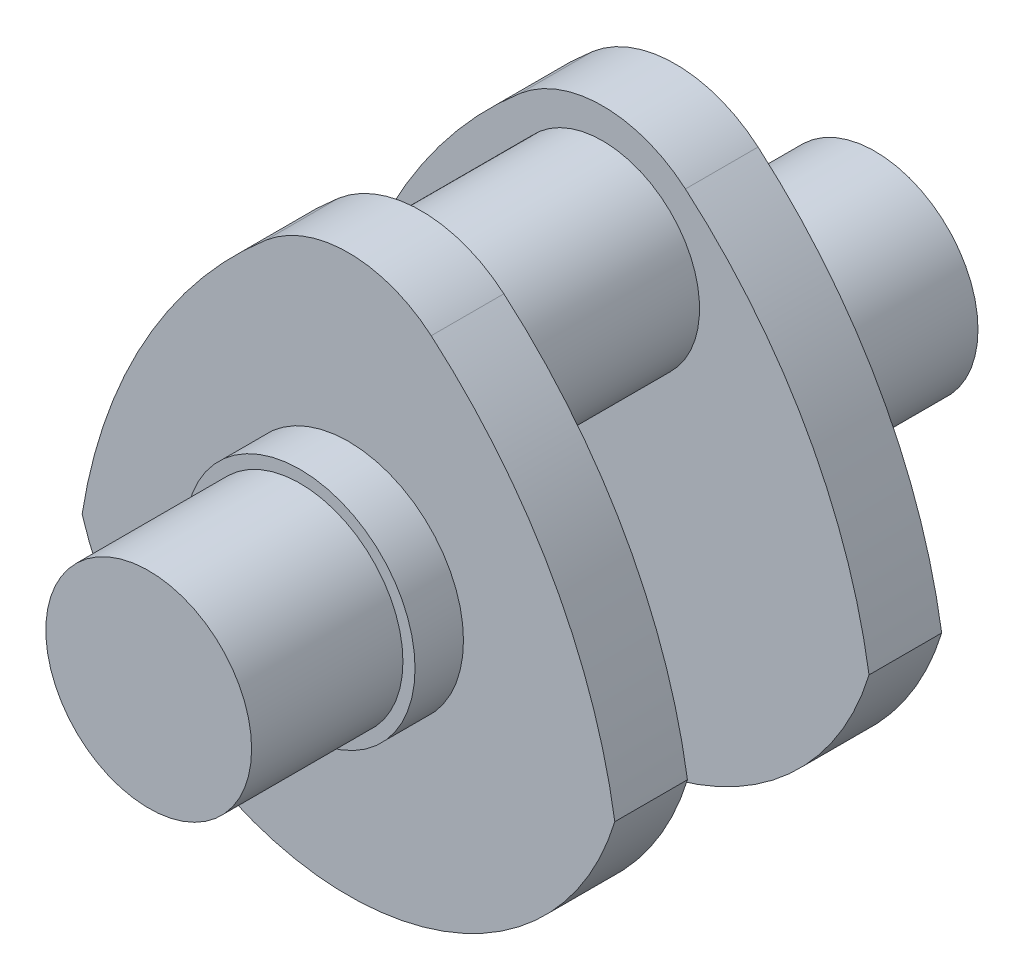
ISO-10303-21;
HEADER;
FILE_DESCRIPTION(('STEP AP214'),'2;1');
FILE_NAME('part.step','',(''),(''),'','','');
FILE_SCHEMA(('AUTOMOTIVE_DESIGN { 1 0 10303 214 1 1 1 1 }'));
ENDSEC;
DATA;
#1=APPLICATION_CONTEXT('core data for automotive mechanical design processes');
#2=APPLICATION_PROTOCOL_DEFINITION('international standard','automotive_design',2000,#1);
#3=PRODUCT_CONTEXT('',#1,'mechanical');
#4=PRODUCT('Part','Part','',(#3));
#5=PRODUCT_RELATED_PRODUCT_CATEGORY('part','',(#4));
#6=PRODUCT_DEFINITION_FORMATION('','',#4);
#7=PRODUCT_DEFINITION_CONTEXT('part definition',#1,'design');
#8=PRODUCT_DEFINITION('design','',#6,#7);
#9=PRODUCT_DEFINITION_SHAPE('','',#8);
#10=(LENGTH_UNIT() NAMED_UNIT(*) SI_UNIT(.MILLI.,.METRE.));
#11=(NAMED_UNIT(*) PLANE_ANGLE_UNIT() SI_UNIT($,.RADIAN.));
#12=(NAMED_UNIT(*) SI_UNIT($,.STERADIAN.) SOLID_ANGLE_UNIT());
#13=UNCERTAINTY_MEASURE_WITH_UNIT(LENGTH_MEASURE(1.E-05),#10,'distance_accuracy_value','');
#14=(GEOMETRIC_REPRESENTATION_CONTEXT(3) GLOBAL_UNCERTAINTY_ASSIGNED_CONTEXT((#13)) GLOBAL_UNIT_ASSIGNED_CONTEXT((#10,
#11,#12)) REPRESENTATION_CONTEXT('',''));
#15=CARTESIAN_POINT('',(0.,0.,0.));
#16=DIRECTION('',(0.,0.,1.));
#17=DIRECTION('',(1.,0.,0.));
#18=AXIS2_PLACEMENT_3D('',#15,#16,#17);
#19=CARTESIAN_POINT('',(0.,0.,25.));
#20=DIRECTION('',(0.,0.,-1.));
#21=DIRECTION('',(-1.,0.,0.));
#22=AXIS2_PLACEMENT_3D('',#19,#20,#21);
#23=CYLINDRICAL_SURFACE('',#22,17.);
#24=CARTESIAN_POINT('',(0.,0.,25.));
#25=DIRECTION('',(0.,0.,1.));
#26=DIRECTION('',(1.,0.,0.));
#27=AXIS2_PLACEMENT_3D('',#24,#25,#26);
#28=CIRCLE('',#27,17.);
#29=CARTESIAN_POINT('',(17.,0.,25.));
#30=VERTEX_POINT('',#29);
#31=EDGE_CURVE('E11',#30,#30,#28,.T.);
#32=ORIENTED_EDGE('',*,*,#31,.F.);
#33=EDGE_LOOP('',(#32));
#34=FACE_BOUND('',#33,.T.);
#35=CARTESIAN_POINT('',(0.,0.,0.));
#36=DIRECTION('',(0.,0.,1.));
#37=DIRECTION('',(1.,0.,0.));
#38=AXIS2_PLACEMENT_3D('',#35,#36,#37);
#39=CIRCLE('',#38,17.);
#40=CARTESIAN_POINT('',(17.,0.,0.));
#41=VERTEX_POINT('',#40);
#42=EDGE_CURVE('E36',#41,#41,#39,.T.);
#43=ORIENTED_EDGE('',*,*,#42,.T.);
#44=EDGE_LOOP('',(#43));
#45=FACE_BOUND('',#44,.T.);
#46=ADVANCED_FACE('F33',(#34,#45),#23,.T.);
#47=CARTESIAN_POINT('',(0.,0.,25.));
#48=DIRECTION('',(0.,0.,1.));
#49=DIRECTION('',(1.,0.,0.));
#50=AXIS2_PLACEMENT_3D('',#47,#48,#49);
#51=PLANE('',#50);
#52=ORIENTED_EDGE('',*,*,#31,.T.);
#53=EDGE_LOOP('',(#52));
#54=FACE_BOUND('',#53,.T.);
#55=ADVANCED_FACE('F212',(#54),#51,.T.);
#56=CARTESIAN_POINT('',(0.,0.,-8.));
#57=DIRECTION('',(0.,0.,1.));
#58=DIRECTION('',(1.,0.,0.));
#59=AXIS2_PLACEMENT_3D('',#56,#57,#58);
#60=CYLINDRICAL_SURFACE('',#59,19.);
#61=CARTESIAN_POINT('',(0.,0.,-8.));
#62=DIRECTION('',(0.,0.,1.));
#63=DIRECTION('',(1.,0.,0.));
#64=AXIS2_PLACEMENT_3D('',#61,#62,#63);
#65=CIRCLE('',#64,19.);
#66=CARTESIAN_POINT('',(19.,0.,-8.));
#67=VERTEX_POINT('',#66);
#68=EDGE_CURVE('E189',#67,#67,#65,.T.);
#69=ORIENTED_EDGE('',*,*,#68,.T.);
#70=EDGE_LOOP('',(#69));
#71=FACE_BOUND('',#70,.T.);
#72=CARTESIAN_POINT('',(0.,0.,0.));
#73=DIRECTION('',(0.,0.,1.));
#74=DIRECTION('',(1.,0.,0.));
#75=AXIS2_PLACEMENT_3D('',#72,#73,#74);
#76=CIRCLE('',#75,19.);
#77=CARTESIAN_POINT('',(19.,0.,0.));
#78=VERTEX_POINT('',#77);
#79=EDGE_CURVE('E192',#78,#78,#76,.T.);
#80=ORIENTED_EDGE('',*,*,#79,.F.);
#81=EDGE_LOOP('',(#80));
#82=FACE_BOUND('',#81,.T.);
#83=ADVANCED_FACE('F203',(#71,#82),#60,.T.);
#84=CARTESIAN_POINT('',(0.,0.,0.));
#85=DIRECTION('',(0.,0.,1.));
#86=DIRECTION('',(1.,0.,0.));
#87=AXIS2_PLACEMENT_3D('',#84,#85,#86);
#88=PLANE('',#87);
#89=ORIENTED_EDGE('',*,*,#42,.F.);
#90=EDGE_LOOP('',(#89));
#91=FACE_BOUND('',#90,.T.);
#92=ORIENTED_EDGE('',*,*,#79,.T.);
#93=EDGE_LOOP('',(#92));
#94=FACE_BOUND('',#93,.T.);
#95=ADVANCED_FACE('F200',(#91,#94),#88,.T.);
#96=CARTESIAN_POINT('',(-44.9094542035734,-27.3845485151599,-20.));
#97=DIRECTION('',(0.,0.,1.));
#98=DIRECTION('',(1.,0.,0.));
#99=AXIS2_PLACEMENT_3D('',#96,#97,#98);
#100=CYLINDRICAL_SURFACE('',#99,90.);
#101=CARTESIAN_POINT('',(-44.9094542035734,-27.3845485151599,-8.));
#102=DIRECTION('',(0.,0.,-1.));
#103=DIRECTION('',(-1.,0.,0.));
#104=AXIS2_PLACEMENT_3D('',#101,#102,#103);
#105=CIRCLE('',#104,90.);
#106=CARTESIAN_POINT('',(13.6680947576093,40.9431234611356,-8.));
#107=VERTEX_POINT('',#106);
#108=CARTESIAN_POINT('',(44.,-13.4164078649987,-8.));
#109=VERTEX_POINT('',#108);
#110=EDGE_CURVE('E168',#107,#109,#105,.T.);
#111=ORIENTED_EDGE('',*,*,#110,.T.);
#112=DIRECTION('',(0.,0.,1.));
#113=VECTOR('',#112,1.);
#114=CARTESIAN_POINT('',(44.,-13.4164078649987,-20.));
#115=LINE('',#114,#113);
#116=CARTESIAN_POINT('',(44.,-13.4164078649987,-20.));
#117=VERTEX_POINT('',#116);
#118=EDGE_CURVE('E187',#117,#109,#115,.T.);
#119=ORIENTED_EDGE('',*,*,#118,.F.);
#120=CARTESIAN_POINT('',(-44.9094542035734,-27.3845485151599,-20.));
#121=DIRECTION('',(0.,0.,-1.));
#122=DIRECTION('',(-1.,0.,0.));
#123=AXIS2_PLACEMENT_3D('',#120,#121,#122);
#124=CIRCLE('',#123,90.);
#125=CARTESIAN_POINT('',(13.6680947576093,40.9431234611356,-20.));
#126=VERTEX_POINT('',#125);
#127=EDGE_CURVE('E169',#126,#117,#124,.T.);
#128=ORIENTED_EDGE('',*,*,#127,.F.);
#129=DIRECTION('',(0.,0.,1.));
#130=VECTOR('',#129,1.);
#131=CARTESIAN_POINT('',(13.6680947576093,40.9431234611356,-20.));
#132=LINE('',#131,#130);
#133=EDGE_CURVE('E175',#126,#107,#132,.T.);
#134=ORIENTED_EDGE('',*,*,#133,.T.);
#135=EDGE_LOOP('',(#111,#119,#128,#134));
#136=FACE_BOUND('',#135,.T.);
#137=ADVANCED_FACE('F202',(#136),#100,.T.);
#138=CARTESIAN_POINT('',(0.,0.,-20.));
#139=DIRECTION('',(0.,0.,1.));
#140=DIRECTION('',(1.,0.,0.));
#141=AXIS2_PLACEMENT_3D('',#138,#139,#140);
#142=CYLINDRICAL_SURFACE('',#141,46.);
#143=CARTESIAN_POINT('',(0.,0.,-8.));
#144=DIRECTION('',(0.,0.,-1.));
#145=DIRECTION('',(-1.,0.,0.));
#146=AXIS2_PLACEMENT_3D('',#143,#144,#145);
#147=CIRCLE('',#146,46.);
#148=CARTESIAN_POINT('',(-44.,-13.4164078649987,-8.));
#149=VERTEX_POINT('',#148);
#150=EDGE_CURVE('E178',#109,#149,#147,.T.);
#151=ORIENTED_EDGE('',*,*,#150,.T.);
#152=DIRECTION('',(0.,0.,1.));
#153=VECTOR('',#152,1.);
#154=CARTESIAN_POINT('',(-44.,-13.4164078649987,-20.));
#155=LINE('',#154,#153);
#156=CARTESIAN_POINT('',(-44.,-13.4164078649987,-20.));
#157=VERTEX_POINT('',#156);
#158=EDGE_CURVE('E185',#157,#149,#155,.T.);
#159=ORIENTED_EDGE('',*,*,#158,.F.);
#160=CARTESIAN_POINT('',(0.,0.,-20.));
#161=DIRECTION('',(0.,0.,-1.));
#162=DIRECTION('',(-1.,0.,0.));
#163=AXIS2_PLACEMENT_3D('',#160,#161,#162);
#164=CIRCLE('',#163,46.);
#165=EDGE_CURVE('E81',#117,#157,#164,.T.);
#166=ORIENTED_EDGE('',*,*,#165,.F.);
#167=ORIENTED_EDGE('',*,*,#118,.T.);
#168=EDGE_LOOP('',(#151,#159,#166,#167));
#169=FACE_BOUND('',#168,.T.);
#170=ADVANCED_FACE('F209',(#169),#142,.T.);
#171=CARTESIAN_POINT('',(44.9094542035734,-27.3845485151599,-20.));
#172=DIRECTION('',(0.,0.,1.));
#173=DIRECTION('',(1.,0.,0.));
#174=AXIS2_PLACEMENT_3D('',#171,#172,#173);
#175=CYLINDRICAL_SURFACE('',#174,90.);
#176=CARTESIAN_POINT('',(44.9094542035734,-27.3845485151599,-8.));
#177=DIRECTION('',(0.,0.,-1.));
#178=DIRECTION('',(1.,0.,0.));
#179=AXIS2_PLACEMENT_3D('',#176,#177,#178);
#180=CIRCLE('',#179,90.);
#181=CARTESIAN_POINT('',(-13.6680947576093,40.9431234611356,-8.));
#182=VERTEX_POINT('',#181);
#183=EDGE_CURVE('E67',#149,#182,#180,.T.);
#184=ORIENTED_EDGE('',*,*,#183,.T.);
#185=DIRECTION('',(0.,0.,1.));
#186=VECTOR('',#185,1.);
#187=CARTESIAN_POINT('',(-13.6680947576093,40.9431234611356,-20.));
#188=LINE('',#187,#186);
#189=CARTESIAN_POINT('',(-13.6680947576093,40.9431234611356,-20.));
#190=VERTEX_POINT('',#189);
#191=EDGE_CURVE('E183',#190,#182,#188,.T.);
#192=ORIENTED_EDGE('',*,*,#191,.F.);
#193=CARTESIAN_POINT('',(44.9094542035734,-27.3845485151599,-20.));
#194=DIRECTION('',(0.,0.,-1.));
#195=DIRECTION('',(1.,0.,0.));
#196=AXIS2_PLACEMENT_3D('',#193,#194,#195);
#197=CIRCLE('',#196,90.);
#198=EDGE_CURVE('E172',#157,#190,#197,.T.);
#199=ORIENTED_EDGE('',*,*,#198,.F.);
#200=ORIENTED_EDGE('',*,*,#158,.T.);
#201=EDGE_LOOP('',(#184,#192,#199,#200));
#202=FACE_BOUND('',#201,.T.);
#203=ADVANCED_FACE('F247',(#202),#175,.T.);
#204=CARTESIAN_POINT('',(0.,25.,-20.));
#205=DIRECTION('',(0.,0.,1.));
#206=DIRECTION('',(1.,0.,0.));
#207=AXIS2_PLACEMENT_3D('',#204,#205,#206);
#208=CYLINDRICAL_SURFACE('',#207,21.);
#209=CARTESIAN_POINT('',(0.,25.,-8.));
#210=DIRECTION('',(0.,0.,-1.));
#211=DIRECTION('',(-1.,0.,0.));
#212=AXIS2_PLACEMENT_3D('',#209,#210,#211);
#213=CIRCLE('',#212,21.);
#214=EDGE_CURVE('E73',#182,#107,#213,.T.);
#215=ORIENTED_EDGE('',*,*,#214,.T.);
#216=ORIENTED_EDGE('',*,*,#133,.F.);
#217=CARTESIAN_POINT('',(0.,25.,-20.));
#218=DIRECTION('',(0.,0.,-1.));
#219=DIRECTION('',(-1.,0.,0.));
#220=AXIS2_PLACEMENT_3D('',#217,#218,#219);
#221=CIRCLE('',#220,21.);
#222=EDGE_CURVE('E49',#190,#126,#221,.T.);
#223=ORIENTED_EDGE('',*,*,#222,.F.);
#224=ORIENTED_EDGE('',*,*,#191,.T.);
#225=EDGE_LOOP('',(#215,#216,#223,#224));
#226=FACE_BOUND('',#225,.T.);
#227=ADVANCED_FACE('F255',(#226),#208,.T.);
#228=CARTESIAN_POINT('',(-22.4547271017867,-13.69227425758,-20.));
#229=DIRECTION('',(0.,0.,-1.));
#230=DIRECTION('',(-1.,0.,0.));
#231=AXIS2_PLACEMENT_3D('',#228,#229,#230);
#232=PLANE('',#231);
#233=CARTESIAN_POINT('',(0.,25.,-20.));
#234=DIRECTION('',(0.,0.,-1.));
#235=DIRECTION('',(-1.,0.,0.));
#236=AXIS2_PLACEMENT_3D('',#233,#234,#235);
#237=CIRCLE('',#236,16.);
#238=CARTESIAN_POINT('',(-16.,25.,-20.));
#239=VERTEX_POINT('',#238);
#240=EDGE_CURVE('E163',#239,#239,#237,.T.);
#241=ORIENTED_EDGE('',*,*,#240,.F.);
#242=EDGE_LOOP('',(#241));
#243=FACE_BOUND('',#242,.T.);
#244=ORIENTED_EDGE('',*,*,#127,.T.);
#245=ORIENTED_EDGE('',*,*,#165,.T.);
#246=ORIENTED_EDGE('',*,*,#198,.T.);
#247=ORIENTED_EDGE('',*,*,#222,.T.);
#248=EDGE_LOOP('',(#244,#245,#246,#247));
#249=FACE_BOUND('',#248,.T.);
#250=ADVANCED_FACE('F263',(#243,#249),#232,.T.);
#251=CARTESIAN_POINT('',(-22.4547271017867,-13.69227425758,-8.));
#252=DIRECTION('',(0.,0.,-1.));
#253=DIRECTION('',(-1.,0.,0.));
#254=AXIS2_PLACEMENT_3D('',#251,#252,#253);
#255=PLANE('',#254);
#256=ORIENTED_EDGE('',*,*,#68,.F.);
#257=EDGE_LOOP('',(#256));
#258=FACE_BOUND('',#257,.T.);
#259=ORIENTED_EDGE('',*,*,#110,.F.);
#260=ORIENTED_EDGE('',*,*,#214,.F.);
#261=ORIENTED_EDGE('',*,*,#183,.F.);
#262=ORIENTED_EDGE('',*,*,#150,.F.);
#263=EDGE_LOOP('',(#259,#260,#261,#262));
#264=FACE_BOUND('',#263,.T.);
#265=ADVANCED_FACE('F271',(#258,#264),#255,.F.);
#266=CARTESIAN_POINT('',(0.,25.,-35.));
#267=DIRECTION('',(0.,0.,1.));
#268=DIRECTION('',(1.,0.,0.));
#269=AXIS2_PLACEMENT_3D('',#266,#267,#268);
#270=CYLINDRICAL_SURFACE('',#269,16.);
#271=ORIENTED_EDGE('',*,*,#240,.T.);
#272=EDGE_LOOP('',(#271));
#273=FACE_BOUND('',#272,.T.);
#274=CARTESIAN_POINT('',(0.,25.,-50.));
#275=DIRECTION('',(0.,0.,-1.));
#276=DIRECTION('',(-1.,0.,0.));
#277=AXIS2_PLACEMENT_3D('',#274,#275,#276);
#278=CIRCLE('',#277,16.);
#279=CARTESIAN_POINT('',(-16.,25.,-50.));
#280=VERTEX_POINT('',#279);
#281=EDGE_CURVE('E139',#280,#280,#278,.T.);
#282=ORIENTED_EDGE('',*,*,#281,.F.);
#283=EDGE_LOOP('',(#282));
#284=FACE_BOUND('',#283,.T.);
#285=ADVANCED_FACE('F280',(#273,#284),#270,.T.);
#286=CARTESIAN_POINT('',(0.,0.,-95.));
#287=DIRECTION('',(0.,0.,1.));
#288=DIRECTION('',(-1.,0.,0.));
#289=AXIS2_PLACEMENT_3D('',#286,#287,#288);
#290=CYLINDRICAL_SURFACE('',#289,17.);
#291=CARTESIAN_POINT('',(0.,0.,-95.));
#292=DIRECTION('',(0.,0.,1.));
#293=DIRECTION('',(1.,0.,0.));
#294=AXIS2_PLACEMENT_3D('',#291,#292,#293);
#295=CIRCLE('',#294,17.);
#296=CARTESIAN_POINT('',(17.,0.,-95.));
#297=VERTEX_POINT('',#296);
#298=EDGE_CURVE('E160',#297,#297,#295,.T.);
#299=ORIENTED_EDGE('',*,*,#298,.T.);
#300=EDGE_LOOP('',(#299));
#301=FACE_BOUND('',#300,.T.);
#302=CARTESIAN_POINT('',(0.,0.,-70.));
#303=DIRECTION('',(0.,0.,1.));
#304=DIRECTION('',(1.,0.,0.));
#305=AXIS2_PLACEMENT_3D('',#302,#303,#304);
#306=CIRCLE('',#305,17.);
#307=CARTESIAN_POINT('',(17.,0.,-70.));
#308=VERTEX_POINT('',#307);
#309=EDGE_CURVE('E159',#308,#308,#306,.T.);
#310=ORIENTED_EDGE('',*,*,#309,.F.);
#311=EDGE_LOOP('',(#310));
#312=FACE_BOUND('',#311,.T.);
#313=ADVANCED_FACE('F290',(#301,#312),#290,.T.);
#314=CARTESIAN_POINT('',(0.,0.,-95.));
#315=DIRECTION('',(0.,0.,-1.));
#316=DIRECTION('',(1.,0.,0.));
#317=AXIS2_PLACEMENT_3D('',#314,#315,#316);
#318=PLANE('',#317);
#319=ORIENTED_EDGE('',*,*,#298,.F.);
#320=EDGE_LOOP('',(#319));
#321=FACE_BOUND('',#320,.T.);
#322=ADVANCED_FACE('F300',(#321),#318,.T.);
#323=CARTESIAN_POINT('',(0.,0.,-62.));
#324=DIRECTION('',(0.,0.,-1.));
#325=DIRECTION('',(1.,0.,0.));
#326=AXIS2_PLACEMENT_3D('',#323,#324,#325);
#327=CYLINDRICAL_SURFACE('',#326,19.);
#328=CARTESIAN_POINT('',(0.,0.,-62.));
#329=DIRECTION('',(0.,0.,1.));
#330=DIRECTION('',(1.,0.,0.));
#331=AXIS2_PLACEMENT_3D('',#328,#329,#330);
#332=CIRCLE('',#331,19.);
#333=CARTESIAN_POINT('',(19.,0.,-62.));
#334=VERTEX_POINT('',#333);
#335=EDGE_CURVE('E128',#334,#334,#332,.T.);
#336=ORIENTED_EDGE('',*,*,#335,.F.);
#337=EDGE_LOOP('',(#336));
#338=FACE_BOUND('',#337,.T.);
#339=CARTESIAN_POINT('',(0.,0.,-70.));
#340=DIRECTION('',(0.,0.,1.));
#341=DIRECTION('',(1.,0.,0.));
#342=AXIS2_PLACEMENT_3D('',#339,#340,#341);
#343=CIRCLE('',#342,19.);
#344=CARTESIAN_POINT('',(19.,0.,-70.));
#345=VERTEX_POINT('',#344);
#346=EDGE_CURVE('E156',#345,#345,#343,.T.);
#347=ORIENTED_EDGE('',*,*,#346,.T.);
#348=EDGE_LOOP('',(#347));
#349=FACE_BOUND('',#348,.T.);
#350=ADVANCED_FACE('F310',(#338,#349),#327,.T.);
#351=CARTESIAN_POINT('',(0.,0.,-70.));
#352=DIRECTION('',(0.,0.,-1.));
#353=DIRECTION('',(1.,0.,0.));
#354=AXIS2_PLACEMENT_3D('',#351,#352,#353);
#355=PLANE('',#354);
#356=ORIENTED_EDGE('',*,*,#309,.T.);
#357=EDGE_LOOP('',(#356));
#358=FACE_BOUND('',#357,.T.);
#359=ORIENTED_EDGE('',*,*,#346,.F.);
#360=EDGE_LOOP('',(#359));
#361=FACE_BOUND('',#360,.T.);
#362=ADVANCED_FACE('F320',(#358,#361),#355,.T.);
#363=CARTESIAN_POINT('',(-44.9094542035734,-27.3845485151599,-50.));
#364=DIRECTION('',(0.,0.,-1.));
#365=DIRECTION('',(1.,0.,0.));
#366=AXIS2_PLACEMENT_3D('',#363,#364,#365);
#367=CYLINDRICAL_SURFACE('',#366,90.);
#368=CARTESIAN_POINT('',(-44.9094542035734,-27.3845485151599,-62.));
#369=DIRECTION('',(0.,0.,-1.));
#370=DIRECTION('',(-1.,0.,0.));
#371=AXIS2_PLACEMENT_3D('',#368,#369,#370);
#372=CIRCLE('',#371,90.);
#373=CARTESIAN_POINT('',(13.6680947576093,40.9431234611356,-62.));
#374=VERTEX_POINT('',#373);
#375=CARTESIAN_POINT('',(44.,-13.4164078649987,-62.));
#376=VERTEX_POINT('',#375);
#377=EDGE_CURVE('E144',#374,#376,#372,.T.);
#378=ORIENTED_EDGE('',*,*,#377,.F.);
#379=DIRECTION('',(0.,0.,-1.));
#380=VECTOR('',#379,1.);
#381=CARTESIAN_POINT('',(13.6680947576093,40.9431234611356,-50.));
#382=LINE('',#381,#380);
#383=CARTESIAN_POINT('',(13.6680947576093,40.9431234611356,-50.));
#384=VERTEX_POINT('',#383);
#385=EDGE_CURVE('E133',#384,#374,#382,.T.);
#386=ORIENTED_EDGE('',*,*,#385,.F.);
#387=CARTESIAN_POINT('',(-44.9094542035734,-27.3845485151599,-50.));
#388=DIRECTION('',(0.,0.,-1.));
#389=DIRECTION('',(-1.,0.,0.));
#390=AXIS2_PLACEMENT_3D('',#387,#388,#389);
#391=CIRCLE('',#390,90.);
#392=CARTESIAN_POINT('',(44.,-13.4164078649987,-50.));
#393=VERTEX_POINT('',#392);
#394=EDGE_CURVE('E112',#384,#393,#391,.T.);
#395=ORIENTED_EDGE('',*,*,#394,.T.);
#396=DIRECTION('',(0.,0.,-1.));
#397=VECTOR('',#396,1.);
#398=CARTESIAN_POINT('',(44.,-13.4164078649987,-50.));
#399=LINE('',#398,#397);
#400=EDGE_CURVE('E121',#393,#376,#399,.T.);
#401=ORIENTED_EDGE('',*,*,#400,.T.);
#402=EDGE_LOOP('',(#378,#386,#395,#401));
#403=FACE_BOUND('',#402,.T.);
#404=ADVANCED_FACE('F131',(#403),#367,.T.);
#405=CARTESIAN_POINT('',(0.,0.,-50.));
#406=DIRECTION('',(0.,0.,-1.));
#407=DIRECTION('',(1.,0.,0.));
#408=AXIS2_PLACEMENT_3D('',#405,#406,#407);
#409=CYLINDRICAL_SURFACE('',#408,46.);
#410=CARTESIAN_POINT('',(0.,0.,-62.));
#411=DIRECTION('',(0.,0.,-1.));
#412=DIRECTION('',(-1.,0.,0.));
#413=AXIS2_PLACEMENT_3D('',#410,#411,#412);
#414=CIRCLE('',#413,46.);
#415=CARTESIAN_POINT('',(-44.,-13.4164078649987,-62.));
#416=VERTEX_POINT('',#415);
#417=EDGE_CURVE('E124',#376,#416,#414,.T.);
#418=ORIENTED_EDGE('',*,*,#417,.F.);
#419=ORIENTED_EDGE('',*,*,#400,.F.);
#420=CARTESIAN_POINT('',(0.,0.,-50.));
#421=DIRECTION('',(0.,0.,-1.));
#422=DIRECTION('',(-1.,0.,0.));
#423=AXIS2_PLACEMENT_3D('',#420,#421,#422);
#424=CIRCLE('',#423,46.);
#425=CARTESIAN_POINT('',(-44.,-13.4164078649987,-50.));
#426=VERTEX_POINT('',#425);
#427=EDGE_CURVE('E108',#393,#426,#424,.T.);
#428=ORIENTED_EDGE('',*,*,#427,.T.);
#429=DIRECTION('',(0.,0.,-1.));
#430=VECTOR('',#429,1.);
#431=CARTESIAN_POINT('',(-44.,-13.4164078649987,-50.));
#432=LINE('',#431,#430);
#433=EDGE_CURVE('E129',#426,#416,#432,.T.);
#434=ORIENTED_EDGE('',*,*,#433,.T.);
#435=EDGE_LOOP('',(#418,#419,#428,#434));
#436=FACE_BOUND('',#435,.T.);
#437=ADVANCED_FACE('F122',(#436),#409,.T.);
#438=CARTESIAN_POINT('',(44.9094542035734,-27.3845485151599,-50.));
#439=DIRECTION('',(0.,0.,-1.));
#440=DIRECTION('',(1.,0.,0.));
#441=AXIS2_PLACEMENT_3D('',#438,#439,#440);
#442=CYLINDRICAL_SURFACE('',#441,90.);
#443=CARTESIAN_POINT('',(44.9094542035734,-27.3845485151599,-62.));
#444=DIRECTION('',(0.,0.,-1.));
#445=DIRECTION('',(1.,0.,0.));
#446=AXIS2_PLACEMENT_3D('',#443,#444,#445);
#447=CIRCLE('',#446,90.);
#448=CARTESIAN_POINT('',(-13.6680947576093,40.9431234611356,-62.));
#449=VERTEX_POINT('',#448);
#450=EDGE_CURVE('E136',#416,#449,#447,.T.);
#451=ORIENTED_EDGE('',*,*,#450,.F.);
#452=ORIENTED_EDGE('',*,*,#433,.F.);
#453=CARTESIAN_POINT('',(44.9094542035734,-27.3845485151599,-50.));
#454=DIRECTION('',(0.,0.,-1.));
#455=DIRECTION('',(1.,0.,0.));
#456=AXIS2_PLACEMENT_3D('',#453,#454,#455);
#457=CIRCLE('',#456,90.);
#458=CARTESIAN_POINT('',(-13.6680947576093,40.9431234611356,-50.));
#459=VERTEX_POINT('',#458);
#460=EDGE_CURVE('E115',#426,#459,#457,.T.);
#461=ORIENTED_EDGE('',*,*,#460,.T.);
#462=DIRECTION('',(0.,0.,-1.));
#463=VECTOR('',#462,1.);
#464=CARTESIAN_POINT('',(-13.6680947576093,40.9431234611356,-50.));
#465=LINE('',#464,#463);
#466=EDGE_CURVE('E150',#459,#449,#465,.T.);
#467=ORIENTED_EDGE('',*,*,#466,.T.);
#468=EDGE_LOOP('',(#451,#452,#461,#467));
#469=FACE_BOUND('',#468,.T.);
#470=ADVANCED_FACE('F347',(#469),#442,.T.);
#471=CARTESIAN_POINT('',(0.,25.,-50.));
#472=DIRECTION('',(0.,0.,-1.));
#473=DIRECTION('',(1.,0.,0.));
#474=AXIS2_PLACEMENT_3D('',#471,#472,#473);
#475=CYLINDRICAL_SURFACE('',#474,21.);
#476=CARTESIAN_POINT('',(0.,25.,-62.));
#477=DIRECTION('',(0.,0.,-1.));
#478=DIRECTION('',(-1.,0.,0.));
#479=AXIS2_PLACEMENT_3D('',#476,#477,#478);
#480=CIRCLE('',#479,21.);
#481=EDGE_CURVE('E134',#449,#374,#480,.T.);
#482=ORIENTED_EDGE('',*,*,#481,.F.);
#483=ORIENTED_EDGE('',*,*,#466,.F.);
#484=CARTESIAN_POINT('',(0.,25.,-50.));
#485=DIRECTION('',(0.,0.,-1.));
#486=DIRECTION('',(-1.,0.,0.));
#487=AXIS2_PLACEMENT_3D('',#484,#485,#486);
#488=CIRCLE('',#487,21.);
#489=EDGE_CURVE('E142',#459,#384,#488,.T.);
#490=ORIENTED_EDGE('',*,*,#489,.T.);
#491=ORIENTED_EDGE('',*,*,#385,.T.);
#492=EDGE_LOOP('',(#482,#483,#490,#491));
#493=FACE_BOUND('',#492,.T.);
#494=ADVANCED_FACE('F356',(#493),#475,.T.);
#495=CARTESIAN_POINT('',(-22.4547271017867,-13.69227425758,-50.));
#496=DIRECTION('',(0.,0.,1.));
#497=DIRECTION('',(-1.,0.,0.));
#498=AXIS2_PLACEMENT_3D('',#495,#496,#497);
#499=PLANE('',#498);
#500=ORIENTED_EDGE('',*,*,#281,.T.);
#501=EDGE_LOOP('',(#500));
#502=FACE_BOUND('',#501,.T.);
#503=ORIENTED_EDGE('',*,*,#394,.F.);
#504=ORIENTED_EDGE('',*,*,#489,.F.);
#505=ORIENTED_EDGE('',*,*,#460,.F.);
#506=ORIENTED_EDGE('',*,*,#427,.F.);
#507=EDGE_LOOP('',(#503,#504,#505,#506));
#508=FACE_BOUND('',#507,.T.);
#509=ADVANCED_FACE('F110',(#502,#508),#499,.T.);
#510=CARTESIAN_POINT('',(-22.4547271017867,-13.69227425758,-62.));
#511=DIRECTION('',(0.,0.,1.));
#512=DIRECTION('',(-1.,0.,0.));
#513=AXIS2_PLACEMENT_3D('',#510,#511,#512);
#514=PLANE('',#513);
#515=ORIENTED_EDGE('',*,*,#335,.T.);
#516=EDGE_LOOP('',(#515));
#517=FACE_BOUND('',#516,.T.);
#518=ORIENTED_EDGE('',*,*,#377,.T.);
#519=ORIENTED_EDGE('',*,*,#417,.T.);
#520=ORIENTED_EDGE('',*,*,#450,.T.);
#521=ORIENTED_EDGE('',*,*,#481,.T.);
#522=EDGE_LOOP('',(#518,#519,#520,#521));
#523=FACE_BOUND('',#522,.T.);
#524=ADVANCED_FACE('F375',(#517,#523),#514,.F.);
#525=CLOSED_SHELL('',(#46,#55,#83,#95,#137,#170,#203,#227,#250,#265,#285,#313,#322,#350,#362,
#404,#437,#470,#494,#509,#524));
#526=MANIFOLD_SOLID_BREP('B2',#525);
#527=ADVANCED_BREP_SHAPE_REPRESENTATION('',(#18,#526),#14);
#528=SHAPE_DEFINITION_REPRESENTATION(#9,#527);
ENDSEC;
END-ISO-10303-21;
